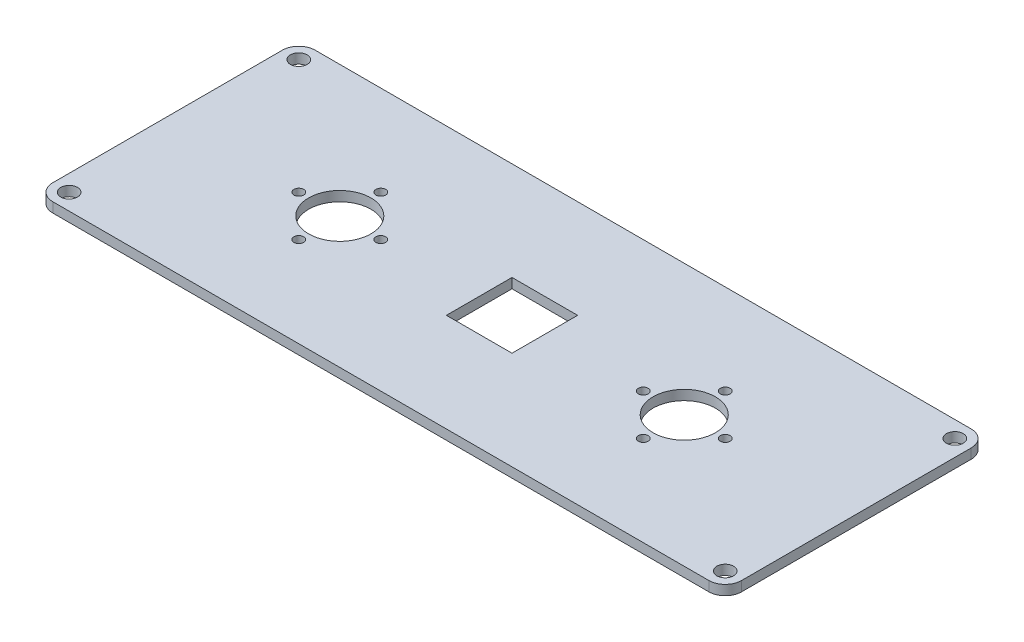
ISO-10303-21;
HEADER;
FILE_DESCRIPTION(('STEP AP214'),'2;1');
FILE_NAME('part.step','',(''),(''),'','','');
FILE_SCHEMA(('AUTOMOTIVE_DESIGN { 1 0 10303 214 1 1 1 1 }'));
ENDSEC;
DATA;
#1=APPLICATION_CONTEXT('core data for automotive mechanical design processes');
#2=APPLICATION_PROTOCOL_DEFINITION('international standard','automotive_design',2000,#1);
#3=PRODUCT_CONTEXT('',#1,'mechanical');
#4=PRODUCT('Part','Part','',(#3));
#5=PRODUCT_RELATED_PRODUCT_CATEGORY('part','',(#4));
#6=PRODUCT_DEFINITION_FORMATION('','',#4);
#7=PRODUCT_DEFINITION_CONTEXT('part definition',#1,'design');
#8=PRODUCT_DEFINITION('design','',#6,#7);
#9=PRODUCT_DEFINITION_SHAPE('','',#8);
#10=(LENGTH_UNIT() NAMED_UNIT(*) SI_UNIT(.MILLI.,.METRE.));
#11=(NAMED_UNIT(*) PLANE_ANGLE_UNIT() SI_UNIT($,.RADIAN.));
#12=(NAMED_UNIT(*) SI_UNIT($,.STERADIAN.) SOLID_ANGLE_UNIT());
#13=UNCERTAINTY_MEASURE_WITH_UNIT(LENGTH_MEASURE(1.E-05),#10,'distance_accuracy_value','');
#14=(GEOMETRIC_REPRESENTATION_CONTEXT(3) GLOBAL_UNCERTAINTY_ASSIGNED_CONTEXT((#13)) GLOBAL_UNIT_ASSIGNED_CONTEXT((#10,
#11,#12)) REPRESENTATION_CONTEXT('',''));
#15=CARTESIAN_POINT('',(0.,0.,0.));
#16=DIRECTION('',(0.,0.,1.));
#17=DIRECTION('',(1.,0.,0.));
#18=AXIS2_PLACEMENT_3D('',#15,#16,#17);
#19=CARTESIAN_POINT('',(0.,-3.,0.));
#20=DIRECTION('',(-1.,0.,0.));
#21=DIRECTION('',(0.,0.,1.));
#22=AXIS2_PLACEMENT_3D('',#19,#20,#21);
#23=PLANE('',#22);
#24=DIRECTION('',(0.,0.,1.));
#25=VECTOR('',#24,1.);
#26=CARTESIAN_POINT('',(0.,-3.,0.));
#27=LINE('',#26,#25);
#28=CARTESIAN_POINT('',(0.,-3.,-75.));
#29=VERTEX_POINT('',#28);
#30=CARTESIAN_POINT('',(0.,-3.,-5.));
#31=VERTEX_POINT('',#30);
#32=EDGE_CURVE('E174',#29,#31,#27,.T.);
#33=ORIENTED_EDGE('',*,*,#32,.T.);
#34=DIRECTION('',(0.,1.,0.));
#35=VECTOR('',#34,1.);
#36=CARTESIAN_POINT('',(0.,-3.,-5.));
#37=LINE('',#36,#35);
#38=CARTESIAN_POINT('',(0.,0.,-5.));
#39=VERTEX_POINT('',#38);
#40=EDGE_CURVE('E198',#31,#39,#37,.T.);
#41=ORIENTED_EDGE('',*,*,#40,.T.);
#42=DIRECTION('',(0.,0.,1.));
#43=VECTOR('',#42,1.);
#44=CARTESIAN_POINT('',(0.,0.,0.));
#45=LINE('',#44,#43);
#46=CARTESIAN_POINT('',(0.,0.,-75.));
#47=VERTEX_POINT('',#46);
#48=EDGE_CURVE('E170',#47,#39,#45,.T.);
#49=ORIENTED_EDGE('',*,*,#48,.F.);
#50=DIRECTION('',(0.,1.,0.));
#51=VECTOR('',#50,1.);
#52=CARTESIAN_POINT('',(0.,-3.,-75.));
#53=LINE('',#52,#51);
#54=EDGE_CURVE('E186',#47,#29,#53,.F.);
#55=ORIENTED_EDGE('',*,*,#54,.T.);
#56=EDGE_LOOP('',(#33,#41,#49,#55));
#57=FACE_BOUND('',#56,.T.);
#58=ADVANCED_FACE('F37',(#57),#23,.T.);
#59=CARTESIAN_POINT('',(0.,-3.,-80.));
#60=DIRECTION('',(0.,0.,-1.));
#61=DIRECTION('',(-1.,0.,0.));
#62=AXIS2_PLACEMENT_3D('',#59,#60,#61);
#63=PLANE('',#62);
#64=DIRECTION('',(-1.,0.,0.));
#65=VECTOR('',#64,1.);
#66=CARTESIAN_POINT('',(0.,0.,-80.));
#67=LINE('',#66,#65);
#68=CARTESIAN_POINT('',(205.,0.,-80.));
#69=VERTEX_POINT('',#68);
#70=CARTESIAN_POINT('',(5.,0.,-80.));
#71=VERTEX_POINT('',#70);
#72=EDGE_CURVE('E178',#69,#71,#67,.T.);
#73=ORIENTED_EDGE('',*,*,#72,.F.);
#74=DIRECTION('',(0.,1.,0.));
#75=VECTOR('',#74,1.);
#76=CARTESIAN_POINT('',(205.,-3.,-80.));
#77=LINE('',#76,#75);
#78=CARTESIAN_POINT('',(205.,-3.,-80.));
#79=VERTEX_POINT('',#78);
#80=EDGE_CURVE('E11',#69,#79,#77,.F.);
#81=ORIENTED_EDGE('',*,*,#80,.T.);
#82=DIRECTION('',(-1.,0.,0.));
#83=VECTOR('',#82,1.);
#84=CARTESIAN_POINT('',(0.,-3.,-80.));
#85=LINE('',#84,#83);
#86=CARTESIAN_POINT('',(5.,-3.,-80.));
#87=VERTEX_POINT('',#86);
#88=EDGE_CURVE('E183',#79,#87,#85,.T.);
#89=ORIENTED_EDGE('',*,*,#88,.T.);
#90=DIRECTION('',(0.,1.,0.));
#91=VECTOR('',#90,1.);
#92=CARTESIAN_POINT('',(5.,-3.,-80.));
#93=LINE('',#92,#91);
#94=EDGE_CURVE('E45',#87,#71,#93,.T.);
#95=ORIENTED_EDGE('',*,*,#94,.T.);
#96=EDGE_LOOP('',(#73,#81,#89,#95));
#97=FACE_BOUND('',#96,.T.);
#98=ADVANCED_FACE('F228',(#97),#63,.T.);
#99=CARTESIAN_POINT('',(210.,-3.,0.));
#100=DIRECTION('',(1.,0.,0.));
#101=DIRECTION('',(0.,0.,-1.));
#102=AXIS2_PLACEMENT_3D('',#99,#100,#101);
#103=PLANE('',#102);
#104=DIRECTION('',(0.,0.,-1.));
#105=VECTOR('',#104,1.);
#106=CARTESIAN_POINT('',(210.,0.,0.));
#107=LINE('',#106,#105);
#108=CARTESIAN_POINT('',(210.,0.,-5.));
#109=VERTEX_POINT('',#108);
#110=CARTESIAN_POINT('',(210.,0.,-75.));
#111=VERTEX_POINT('',#110);
#112=EDGE_CURVE('E192',#109,#111,#107,.T.);
#113=ORIENTED_EDGE('',*,*,#112,.F.);
#114=DIRECTION('',(0.,1.,0.));
#115=VECTOR('',#114,1.);
#116=CARTESIAN_POINT('',(210.,-3.,-5.));
#117=LINE('',#116,#115);
#118=CARTESIAN_POINT('',(210.,-3.,-5.));
#119=VERTEX_POINT('',#118);
#120=EDGE_CURVE('E59',#109,#119,#117,.F.);
#121=ORIENTED_EDGE('',*,*,#120,.T.);
#122=DIRECTION('',(0.,0.,-1.));
#123=VECTOR('',#122,1.);
#124=CARTESIAN_POINT('',(210.,-3.,0.));
#125=LINE('',#124,#123);
#126=CARTESIAN_POINT('',(210.,-3.,-75.));
#127=VERTEX_POINT('',#126);
#128=EDGE_CURVE('E181',#119,#127,#125,.T.);
#129=ORIENTED_EDGE('',*,*,#128,.T.);
#130=DIRECTION('',(0.,1.,0.));
#131=VECTOR('',#130,1.);
#132=CARTESIAN_POINT('',(210.,-3.,-75.));
#133=LINE('',#132,#131);
#134=EDGE_CURVE('E221',#127,#111,#133,.T.);
#135=ORIENTED_EDGE('',*,*,#134,.T.);
#136=EDGE_LOOP('',(#113,#121,#129,#135));
#137=FACE_BOUND('',#136,.T.);
#138=ADVANCED_FACE('F238',(#137),#103,.T.);
#139=CARTESIAN_POINT('',(0.,-3.,0.));
#140=DIRECTION('',(0.,0.,1.));
#141=DIRECTION('',(1.,0.,0.));
#142=AXIS2_PLACEMENT_3D('',#139,#140,#141);
#143=PLANE('',#142);
#144=DIRECTION('',(1.,0.,0.));
#145=VECTOR('',#144,1.);
#146=CARTESIAN_POINT('',(0.,0.,0.));
#147=LINE('',#146,#145);
#148=CARTESIAN_POINT('',(5.,0.,0.));
#149=VERTEX_POINT('',#148);
#150=CARTESIAN_POINT('',(205.,0.,0.));
#151=VERTEX_POINT('',#150);
#152=EDGE_CURVE('E189',#149,#151,#147,.T.);
#153=ORIENTED_EDGE('',*,*,#152,.F.);
#154=DIRECTION('',(0.,1.,0.));
#155=VECTOR('',#154,1.);
#156=CARTESIAN_POINT('',(5.,-3.,0.));
#157=LINE('',#156,#155);
#158=CARTESIAN_POINT('',(5.,-3.,0.));
#159=VERTEX_POINT('',#158);
#160=EDGE_CURVE('E212',#149,#159,#157,.F.);
#161=ORIENTED_EDGE('',*,*,#160,.T.);
#162=DIRECTION('',(1.,0.,0.));
#163=VECTOR('',#162,1.);
#164=CARTESIAN_POINT('',(0.,-3.,0.));
#165=LINE('',#164,#163);
#166=CARTESIAN_POINT('',(205.,-3.,0.));
#167=VERTEX_POINT('',#166);
#168=EDGE_CURVE('E177',#159,#167,#165,.T.);
#169=ORIENTED_EDGE('',*,*,#168,.T.);
#170=DIRECTION('',(0.,1.,0.));
#171=VECTOR('',#170,1.);
#172=CARTESIAN_POINT('',(205.,-3.,0.));
#173=LINE('',#172,#171);
#174=EDGE_CURVE('E209',#167,#151,#173,.T.);
#175=ORIENTED_EDGE('',*,*,#174,.T.);
#176=EDGE_LOOP('',(#153,#161,#169,#175));
#177=FACE_BOUND('',#176,.T.);
#178=ADVANCED_FACE('F246',(#177),#143,.T.);
#179=CARTESIAN_POINT('',(0.,-3.,0.));
#180=DIRECTION('',(0.,-1.,0.));
#181=DIRECTION('',(0.,0.,-1.));
#182=AXIS2_PLACEMENT_3D('',#179,#180,#181);
#183=PLANE('',#182);
#184=CARTESIAN_POINT('',(5.,-3.,-75.));
#185=DIRECTION('',(0.,1.,0.));
#186=DIRECTION('',(0.,0.,1.));
#187=AXIS2_PLACEMENT_3D('',#184,#185,#186);
#188=CIRCLE('',#187,2.5527);
#189=CARTESIAN_POINT('',(5.,-3.,-72.4473));
#190=VERTEX_POINT('',#189);
#191=EDGE_CURVE('E670',#190,#190,#188,.T.);
#192=ORIENTED_EDGE('',*,*,#191,.T.);
#193=EDGE_LOOP('',(#192));
#194=FACE_BOUND('',#193,.T.);
#195=CARTESIAN_POINT('',(5.,-3.,-5.));
#196=DIRECTION('',(0.,1.,0.));
#197=DIRECTION('',(0.,0.,1.));
#198=AXIS2_PLACEMENT_3D('',#195,#196,#197);
#199=CIRCLE('',#198,2.5527);
#200=CARTESIAN_POINT('',(5.,-3.,-2.4473));
#201=VERTEX_POINT('',#200);
#202=EDGE_CURVE('E664',#201,#201,#199,.T.);
#203=ORIENTED_EDGE('',*,*,#202,.T.);
#204=EDGE_LOOP('',(#203));
#205=FACE_BOUND('',#204,.T.);
#206=CARTESIAN_POINT('',(205.,-3.,-5.));
#207=DIRECTION('',(0.,1.,0.));
#208=DIRECTION('',(0.,0.,1.));
#209=AXIS2_PLACEMENT_3D('',#206,#207,#208);
#210=CIRCLE('',#209,2.55269999999999);
#211=CARTESIAN_POINT('',(205.,-3.,-2.44730000000001));
#212=VERTEX_POINT('',#211);
#213=EDGE_CURVE('E658',#212,#212,#210,.T.);
#214=ORIENTED_EDGE('',*,*,#213,.T.);
#215=EDGE_LOOP('',(#214));
#216=FACE_BOUND('',#215,.T.);
#217=CARTESIAN_POINT('',(205.,-3.,-75.));
#218=DIRECTION('',(0.,1.,0.));
#219=DIRECTION('',(0.,0.,1.));
#220=AXIS2_PLACEMENT_3D('',#217,#218,#219);
#221=CIRCLE('',#220,2.55269999999999);
#222=CARTESIAN_POINT('',(205.,-3.,-72.4473));
#223=VERTEX_POINT('',#222);
#224=EDGE_CURVE('E551',#223,#223,#221,.T.);
#225=ORIENTED_EDGE('',*,*,#224,.T.);
#226=EDGE_LOOP('',(#225));
#227=FACE_BOUND('',#226,.T.);
#228=CARTESIAN_POINT('',(52.5,-3.,-40.));
#229=DIRECTION('',(0.,1.,0.));
#230=DIRECTION('',(0.,0.,1.));
#231=AXIS2_PLACEMENT_3D('',#228,#229,#230);
#232=CIRCLE('',#231,9.5);
#233=CARTESIAN_POINT('',(52.5,-3.,-30.5));
#234=VERTEX_POINT('',#233);
#235=EDGE_CURVE('E546',#234,#234,#232,.T.);
#236=ORIENTED_EDGE('',*,*,#235,.T.);
#237=EDGE_LOOP('',(#236));
#238=FACE_BOUND('',#237,.T.);
#239=CARTESIAN_POINT('',(157.5,-3.,-40.));
#240=DIRECTION('',(0.,1.,0.));
#241=DIRECTION('',(0.,0.,1.));
#242=AXIS2_PLACEMENT_3D('',#239,#240,#241);
#243=CIRCLE('',#242,9.50000000000001);
#244=CARTESIAN_POINT('',(157.5,-3.,-30.5));
#245=VERTEX_POINT('',#244);
#246=EDGE_CURVE('E559',#245,#245,#243,.T.);
#247=ORIENTED_EDGE('',*,*,#246,.T.);
#248=EDGE_LOOP('',(#247));
#249=FACE_BOUND('',#248,.T.);
#250=CARTESIAN_POINT('',(145.,-3.,-40.));
#251=DIRECTION('',(0.,1.,0.));
#252=DIRECTION('',(0.,0.,1.));
#253=AXIS2_PLACEMENT_3D('',#250,#251,#252);
#254=CIRCLE('',#253,1.49999999999999);
#255=CARTESIAN_POINT('',(145.,-3.,-38.5));
#256=VERTEX_POINT('',#255);
#257=EDGE_CURVE('E565',#256,#256,#254,.T.);
#258=ORIENTED_EDGE('',*,*,#257,.T.);
#259=EDGE_LOOP('',(#258));
#260=FACE_BOUND('',#259,.T.);
#261=CARTESIAN_POINT('',(157.5,-3.,-27.5));
#262=DIRECTION('',(0.,1.,0.));
#263=DIRECTION('',(0.,0.,1.));
#264=AXIS2_PLACEMENT_3D('',#261,#262,#263);
#265=CIRCLE('',#264,1.5);
#266=CARTESIAN_POINT('',(157.5,-3.,-26.));
#267=VERTEX_POINT('',#266);
#268=EDGE_CURVE('E571',#267,#267,#265,.T.);
#269=ORIENTED_EDGE('',*,*,#268,.T.);
#270=EDGE_LOOP('',(#269));
#271=FACE_BOUND('',#270,.T.);
#272=CARTESIAN_POINT('',(170.,-3.,-40.0000000000001));
#273=DIRECTION('',(0.,1.,0.));
#274=DIRECTION('',(0.,0.,1.));
#275=AXIS2_PLACEMENT_3D('',#272,#273,#274);
#276=CIRCLE('',#275,1.5);
#277=CARTESIAN_POINT('',(170.,-3.,-38.5000000000001));
#278=VERTEX_POINT('',#277);
#279=EDGE_CURVE('E577',#278,#278,#276,.T.);
#280=ORIENTED_EDGE('',*,*,#279,.T.);
#281=EDGE_LOOP('',(#280));
#282=FACE_BOUND('',#281,.T.);
#283=CARTESIAN_POINT('',(40.0000000000002,-3.,-40.));
#284=DIRECTION('',(0.,1.,0.));
#285=DIRECTION('',(0.,0.,1.));
#286=AXIS2_PLACEMENT_3D('',#283,#284,#285);
#287=CIRCLE('',#286,1.50000000000001);
#288=CARTESIAN_POINT('',(40.0000000000002,-3.,-38.5));
#289=VERTEX_POINT('',#288);
#290=EDGE_CURVE('E583',#289,#289,#287,.T.);
#291=ORIENTED_EDGE('',*,*,#290,.T.);
#292=EDGE_LOOP('',(#291));
#293=FACE_BOUND('',#292,.T.);
#294=CARTESIAN_POINT('',(52.5000000000003,-3.,-27.5));
#295=DIRECTION('',(0.,1.,0.));
#296=DIRECTION('',(0.,0.,1.));
#297=AXIS2_PLACEMENT_3D('',#294,#295,#296);
#298=CIRCLE('',#297,1.5);
#299=CARTESIAN_POINT('',(52.5000000000003,-3.,-26.));
#300=VERTEX_POINT('',#299);
#301=EDGE_CURVE('E589',#300,#300,#298,.T.);
#302=ORIENTED_EDGE('',*,*,#301,.T.);
#303=EDGE_LOOP('',(#302));
#304=FACE_BOUND('',#303,.T.);
#305=CARTESIAN_POINT('',(65.0000000000002,-3.,-40.0000000000001));
#306=DIRECTION('',(0.,1.,0.));
#307=DIRECTION('',(0.,0.,1.));
#308=AXIS2_PLACEMENT_3D('',#305,#306,#307);
#309=CIRCLE('',#308,1.50000000000001);
#310=CARTESIAN_POINT('',(65.0000000000002,-3.,-38.5000000000001));
#311=VERTEX_POINT('',#310);
#312=EDGE_CURVE('E595',#311,#311,#309,.T.);
#313=ORIENTED_EDGE('',*,*,#312,.T.);
#314=EDGE_LOOP('',(#313));
#315=FACE_BOUND('',#314,.T.);
#316=CARTESIAN_POINT('',(157.5,-3.,-52.5));
#317=DIRECTION('',(0.,1.,0.));
#318=DIRECTION('',(0.,0.,1.));
#319=AXIS2_PLACEMENT_3D('',#316,#317,#318);
#320=CIRCLE('',#319,1.5);
#321=CARTESIAN_POINT('',(157.5,-3.,-51.));
#322=VERTEX_POINT('',#321);
#323=EDGE_CURVE('E601',#322,#322,#320,.T.);
#324=ORIENTED_EDGE('',*,*,#323,.T.);
#325=EDGE_LOOP('',(#324));
#326=FACE_BOUND('',#325,.T.);
#327=CARTESIAN_POINT('',(52.5,-3.,-52.5));
#328=DIRECTION('',(0.,1.,0.));
#329=DIRECTION('',(0.,0.,1.));
#330=AXIS2_PLACEMENT_3D('',#327,#328,#329);
#331=CIRCLE('',#330,1.5);
#332=CARTESIAN_POINT('',(52.5,-3.,-51.));
#333=VERTEX_POINT('',#332);
#334=EDGE_CURVE('E164',#333,#333,#331,.T.);
#335=ORIENTED_EDGE('',*,*,#334,.T.);
#336=EDGE_LOOP('',(#335));
#337=FACE_BOUND('',#336,.T.);
#338=DIRECTION('',(0.,0.,1.));
#339=VECTOR('',#338,1.);
#340=CARTESIAN_POINT('',(95.,-3.,-50.));
#341=LINE('',#340,#339);
#342=CARTESIAN_POINT('',(95.,-3.,-50.));
#343=VERTEX_POINT('',#342);
#344=CARTESIAN_POINT('',(95.,-3.,-30.));
#345=VERTEX_POINT('',#344);
#346=EDGE_CURVE('E131',#343,#345,#341,.T.);
#347=ORIENTED_EDGE('',*,*,#346,.T.);
#348=DIRECTION('',(1.,0.,0.));
#349=VECTOR('',#348,1.);
#350=CARTESIAN_POINT('',(95.,-3.,-30.));
#351=LINE('',#350,#349);
#352=CARTESIAN_POINT('',(115.,-3.,-30.));
#353=VERTEX_POINT('',#352);
#354=EDGE_CURVE('E143',#345,#353,#351,.T.);
#355=ORIENTED_EDGE('',*,*,#354,.T.);
#356=DIRECTION('',(0.,0.,-1.));
#357=VECTOR('',#356,1.);
#358=CARTESIAN_POINT('',(115.,-3.,-50.));
#359=LINE('',#358,#357);
#360=CARTESIAN_POINT('',(115.,-3.,-50.));
#361=VERTEX_POINT('',#360);
#362=EDGE_CURVE('E147',#353,#361,#359,.T.);
#363=ORIENTED_EDGE('',*,*,#362,.T.);
#364=DIRECTION('',(-1.,0.,0.));
#365=VECTOR('',#364,1.);
#366=CARTESIAN_POINT('',(95.,-3.,-50.));
#367=LINE('',#366,#365);
#368=EDGE_CURVE('E139',#361,#343,#367,.T.);
#369=ORIENTED_EDGE('',*,*,#368,.T.);
#370=EDGE_LOOP('',(#347,#355,#363,#369));
#371=FACE_BOUND('',#370,.T.);
#372=ORIENTED_EDGE('',*,*,#168,.F.);
#373=CARTESIAN_POINT('',(5.,-3.,-5.));
#374=DIRECTION('',(0.,-1.,0.));
#375=DIRECTION('',(0.,0.,-1.));
#376=AXIS2_PLACEMENT_3D('',#373,#374,#375);
#377=CIRCLE('',#376,5.);
#378=EDGE_CURVE('E219',#159,#31,#377,.T.);
#379=ORIENTED_EDGE('',*,*,#378,.T.);
#380=ORIENTED_EDGE('',*,*,#32,.F.);
#381=CARTESIAN_POINT('',(5.,-3.,-75.));
#382=DIRECTION('',(0.,-1.,0.));
#383=DIRECTION('',(0.,0.,-1.));
#384=AXIS2_PLACEMENT_3D('',#381,#382,#383);
#385=CIRCLE('',#384,5.);
#386=EDGE_CURVE('E214',#29,#87,#385,.T.);
#387=ORIENTED_EDGE('',*,*,#386,.T.);
#388=ORIENTED_EDGE('',*,*,#88,.F.);
#389=CARTESIAN_POINT('',(205.,-3.,-75.));
#390=DIRECTION('',(0.,-1.,0.));
#391=DIRECTION('',(0.,0.,-1.));
#392=AXIS2_PLACEMENT_3D('',#389,#390,#391);
#393=CIRCLE('',#392,5.);
#394=EDGE_CURVE('E52',#79,#127,#393,.T.);
#395=ORIENTED_EDGE('',*,*,#394,.T.);
#396=ORIENTED_EDGE('',*,*,#128,.F.);
#397=CARTESIAN_POINT('',(205.,-3.,-5.));
#398=DIRECTION('',(0.,-1.,0.));
#399=DIRECTION('',(0.,0.,-1.));
#400=AXIS2_PLACEMENT_3D('',#397,#398,#399);
#401=CIRCLE('',#400,5.);
#402=EDGE_CURVE('E217',#119,#167,#401,.T.);
#403=ORIENTED_EDGE('',*,*,#402,.T.);
#404=EDGE_LOOP('',(#372,#379,#380,#387,#388,#395,#396,#403));
#405=FACE_BOUND('',#404,.T.);
#406=ADVANCED_FACE('F149',(#194,#205,#216,#227,#238,#249,#260,#271,#282,#293,#304,#315,#326,
#337,#371,#405),#183,.T.);
#407=CARTESIAN_POINT('',(0.,0.,0.));
#408=DIRECTION('',(0.,-1.,0.));
#409=DIRECTION('',(0.,0.,-1.));
#410=AXIS2_PLACEMENT_3D('',#407,#408,#409);
#411=PLANE('',#410);
#412=CARTESIAN_POINT('',(5.,0.,-75.));
#413=DIRECTION('',(0.,1.,0.));
#414=DIRECTION('',(0.,0.,1.));
#415=AXIS2_PLACEMENT_3D('',#412,#413,#414);
#416=CIRCLE('',#415,2.55269999999999);
#417=CARTESIAN_POINT('',(5.,0.,-72.4473));
#418=VERTEX_POINT('',#417);
#419=EDGE_CURVE('E673',#418,#418,#416,.T.);
#420=ORIENTED_EDGE('',*,*,#419,.F.);
#421=EDGE_LOOP('',(#420));
#422=FACE_BOUND('',#421,.T.);
#423=CARTESIAN_POINT('',(5.,0.,-5.));
#424=DIRECTION('',(0.,1.,0.));
#425=DIRECTION('',(0.,0.,1.));
#426=AXIS2_PLACEMENT_3D('',#423,#424,#425);
#427=CIRCLE('',#426,2.55269999999999);
#428=CARTESIAN_POINT('',(5.,0.,-2.44730000000001));
#429=VERTEX_POINT('',#428);
#430=EDGE_CURVE('E667',#429,#429,#427,.T.);
#431=ORIENTED_EDGE('',*,*,#430,.F.);
#432=EDGE_LOOP('',(#431));
#433=FACE_BOUND('',#432,.T.);
#434=CARTESIAN_POINT('',(205.,0.,-5.));
#435=DIRECTION('',(0.,1.,0.));
#436=DIRECTION('',(0.,0.,1.));
#437=AXIS2_PLACEMENT_3D('',#434,#435,#436);
#438=CIRCLE('',#437,2.55269999999999);
#439=CARTESIAN_POINT('',(205.,0.,-2.44730000000001));
#440=VERTEX_POINT('',#439);
#441=EDGE_CURVE('E661',#440,#440,#438,.T.);
#442=ORIENTED_EDGE('',*,*,#441,.F.);
#443=EDGE_LOOP('',(#442));
#444=FACE_BOUND('',#443,.T.);
#445=CARTESIAN_POINT('',(205.,0.,-75.));
#446=DIRECTION('',(0.,1.,0.));
#447=DIRECTION('',(0.,0.,1.));
#448=AXIS2_PLACEMENT_3D('',#445,#446,#447);
#449=CIRCLE('',#448,2.55269999999999);
#450=CARTESIAN_POINT('',(205.,0.,-72.4473));
#451=VERTEX_POINT('',#450);
#452=EDGE_CURVE('E556',#451,#451,#449,.T.);
#453=ORIENTED_EDGE('',*,*,#452,.F.);
#454=EDGE_LOOP('',(#453));
#455=FACE_BOUND('',#454,.T.);
#456=CARTESIAN_POINT('',(52.5,0.,-40.));
#457=DIRECTION('',(0.,1.,0.));
#458=DIRECTION('',(0.,0.,1.));
#459=AXIS2_PLACEMENT_3D('',#456,#457,#458);
#460=CIRCLE('',#459,9.5);
#461=CARTESIAN_POINT('',(52.5,0.,-30.5));
#462=VERTEX_POINT('',#461);
#463=EDGE_CURVE('E549',#462,#462,#460,.T.);
#464=ORIENTED_EDGE('',*,*,#463,.F.);
#465=EDGE_LOOP('',(#464));
#466=FACE_BOUND('',#465,.T.);
#467=CARTESIAN_POINT('',(157.5,0.,-40.));
#468=DIRECTION('',(0.,1.,0.));
#469=DIRECTION('',(0.,0.,1.));
#470=AXIS2_PLACEMENT_3D('',#467,#468,#469);
#471=CIRCLE('',#470,9.50000000000001);
#472=CARTESIAN_POINT('',(157.5,0.,-30.5));
#473=VERTEX_POINT('',#472);
#474=EDGE_CURVE('E553',#473,#473,#471,.T.);
#475=ORIENTED_EDGE('',*,*,#474,.F.);
#476=EDGE_LOOP('',(#475));
#477=FACE_BOUND('',#476,.T.);
#478=CARTESIAN_POINT('',(145.,0.,-40.));
#479=DIRECTION('',(0.,1.,0.));
#480=DIRECTION('',(0.,0.,1.));
#481=AXIS2_PLACEMENT_3D('',#478,#479,#480);
#482=CIRCLE('',#481,1.49999999999999);
#483=CARTESIAN_POINT('',(145.,0.,-38.5));
#484=VERTEX_POINT('',#483);
#485=EDGE_CURVE('E562',#484,#484,#482,.T.);
#486=ORIENTED_EDGE('',*,*,#485,.F.);
#487=EDGE_LOOP('',(#486));
#488=FACE_BOUND('',#487,.T.);
#489=CARTESIAN_POINT('',(157.5,0.,-27.5));
#490=DIRECTION('',(0.,1.,0.));
#491=DIRECTION('',(0.,0.,1.));
#492=AXIS2_PLACEMENT_3D('',#489,#490,#491);
#493=CIRCLE('',#492,1.5);
#494=CARTESIAN_POINT('',(157.5,0.,-26.));
#495=VERTEX_POINT('',#494);
#496=EDGE_CURVE('E568',#495,#495,#493,.T.);
#497=ORIENTED_EDGE('',*,*,#496,.F.);
#498=EDGE_LOOP('',(#497));
#499=FACE_BOUND('',#498,.T.);
#500=CARTESIAN_POINT('',(170.,0.,-40.0000000000001));
#501=DIRECTION('',(0.,1.,0.));
#502=DIRECTION('',(0.,0.,1.));
#503=AXIS2_PLACEMENT_3D('',#500,#501,#502);
#504=CIRCLE('',#503,1.5);
#505=CARTESIAN_POINT('',(170.,0.,-38.5000000000001));
#506=VERTEX_POINT('',#505);
#507=EDGE_CURVE('E574',#506,#506,#504,.T.);
#508=ORIENTED_EDGE('',*,*,#507,.F.);
#509=EDGE_LOOP('',(#508));
#510=FACE_BOUND('',#509,.T.);
#511=CARTESIAN_POINT('',(40.0000000000002,0.,-40.));
#512=DIRECTION('',(0.,1.,0.));
#513=DIRECTION('',(0.,0.,1.));
#514=AXIS2_PLACEMENT_3D('',#511,#512,#513);
#515=CIRCLE('',#514,1.50000000000001);
#516=CARTESIAN_POINT('',(40.0000000000002,0.,-38.5));
#517=VERTEX_POINT('',#516);
#518=EDGE_CURVE('E580',#517,#517,#515,.T.);
#519=ORIENTED_EDGE('',*,*,#518,.F.);
#520=EDGE_LOOP('',(#519));
#521=FACE_BOUND('',#520,.T.);
#522=CARTESIAN_POINT('',(52.5000000000003,0.,-27.5));
#523=DIRECTION('',(0.,1.,0.));
#524=DIRECTION('',(0.,0.,1.));
#525=AXIS2_PLACEMENT_3D('',#522,#523,#524);
#526=CIRCLE('',#525,1.5);
#527=CARTESIAN_POINT('',(52.5000000000003,0.,-26.));
#528=VERTEX_POINT('',#527);
#529=EDGE_CURVE('E586',#528,#528,#526,.T.);
#530=ORIENTED_EDGE('',*,*,#529,.F.);
#531=EDGE_LOOP('',(#530));
#532=FACE_BOUND('',#531,.T.);
#533=CARTESIAN_POINT('',(65.0000000000002,0.,-40.0000000000001));
#534=DIRECTION('',(0.,1.,0.));
#535=DIRECTION('',(0.,0.,1.));
#536=AXIS2_PLACEMENT_3D('',#533,#534,#535);
#537=CIRCLE('',#536,1.50000000000001);
#538=CARTESIAN_POINT('',(65.0000000000002,0.,-38.5000000000001));
#539=VERTEX_POINT('',#538);
#540=EDGE_CURVE('E592',#539,#539,#537,.T.);
#541=ORIENTED_EDGE('',*,*,#540,.F.);
#542=EDGE_LOOP('',(#541));
#543=FACE_BOUND('',#542,.T.);
#544=CARTESIAN_POINT('',(157.5,0.,-52.5));
#545=DIRECTION('',(0.,1.,0.));
#546=DIRECTION('',(0.,0.,1.));
#547=AXIS2_PLACEMENT_3D('',#544,#545,#546);
#548=CIRCLE('',#547,1.5);
#549=CARTESIAN_POINT('',(157.5,0.,-51.));
#550=VERTEX_POINT('',#549);
#551=EDGE_CURVE('E598',#550,#550,#548,.T.);
#552=ORIENTED_EDGE('',*,*,#551,.F.);
#553=EDGE_LOOP('',(#552));
#554=FACE_BOUND('',#553,.T.);
#555=CARTESIAN_POINT('',(52.5,0.,-52.5));
#556=DIRECTION('',(0.,1.,0.));
#557=DIRECTION('',(0.,0.,1.));
#558=AXIS2_PLACEMENT_3D('',#555,#556,#557);
#559=CIRCLE('',#558,1.5);
#560=CARTESIAN_POINT('',(52.5,0.,-51.));
#561=VERTEX_POINT('',#560);
#562=EDGE_CURVE('E157',#561,#561,#559,.T.);
#563=ORIENTED_EDGE('',*,*,#562,.F.);
#564=EDGE_LOOP('',(#563));
#565=FACE_BOUND('',#564,.T.);
#566=DIRECTION('',(1.,0.,0.));
#567=VECTOR('',#566,1.);
#568=CARTESIAN_POINT('',(95.,0.,-30.));
#569=LINE('',#568,#567);
#570=CARTESIAN_POINT('',(95.,0.,-30.));
#571=VERTEX_POINT('',#570);
#572=CARTESIAN_POINT('',(115.,0.,-30.));
#573=VERTEX_POINT('',#572);
#574=EDGE_CURVE('E163',#571,#573,#569,.T.);
#575=ORIENTED_EDGE('',*,*,#574,.F.);
#576=DIRECTION('',(0.,0.,1.));
#577=VECTOR('',#576,1.);
#578=CARTESIAN_POINT('',(95.,0.,-50.));
#579=LINE('',#578,#577);
#580=CARTESIAN_POINT('',(95.,0.,-50.));
#581=VERTEX_POINT('',#580);
#582=EDGE_CURVE('E134',#581,#571,#579,.T.);
#583=ORIENTED_EDGE('',*,*,#582,.F.);
#584=DIRECTION('',(-1.,0.,0.));
#585=VECTOR('',#584,1.);
#586=CARTESIAN_POINT('',(95.,0.,-50.));
#587=LINE('',#586,#585);
#588=CARTESIAN_POINT('',(115.,0.,-50.));
#589=VERTEX_POINT('',#588);
#590=EDGE_CURVE('E151',#589,#581,#587,.T.);
#591=ORIENTED_EDGE('',*,*,#590,.F.);
#592=DIRECTION('',(0.,0.,-1.));
#593=VECTOR('',#592,1.);
#594=CARTESIAN_POINT('',(115.,0.,-50.));
#595=LINE('',#594,#593);
#596=EDGE_CURVE('E154',#573,#589,#595,.T.);
#597=ORIENTED_EDGE('',*,*,#596,.F.);
#598=EDGE_LOOP('',(#575,#583,#591,#597));
#599=FACE_BOUND('',#598,.T.);
#600=ORIENTED_EDGE('',*,*,#48,.T.);
#601=CARTESIAN_POINT('',(5.,0.,-5.));
#602=DIRECTION('',(0.,-1.,0.));
#603=DIRECTION('',(0.,0.,-1.));
#604=AXIS2_PLACEMENT_3D('',#601,#602,#603);
#605=CIRCLE('',#604,5.);
#606=EDGE_CURVE('E207',#39,#149,#605,.F.);
#607=ORIENTED_EDGE('',*,*,#606,.T.);
#608=ORIENTED_EDGE('',*,*,#152,.T.);
#609=CARTESIAN_POINT('',(205.,0.,-5.));
#610=DIRECTION('',(0.,-1.,0.));
#611=DIRECTION('',(0.,0.,-1.));
#612=AXIS2_PLACEMENT_3D('',#609,#610,#611);
#613=CIRCLE('',#612,5.);
#614=EDGE_CURVE('E205',#151,#109,#613,.F.);
#615=ORIENTED_EDGE('',*,*,#614,.T.);
#616=ORIENTED_EDGE('',*,*,#112,.T.);
#617=CARTESIAN_POINT('',(205.,0.,-75.));
#618=DIRECTION('',(0.,-1.,0.));
#619=DIRECTION('',(0.,0.,-1.));
#620=AXIS2_PLACEMENT_3D('',#617,#618,#619);
#621=CIRCLE('',#620,5.);
#622=EDGE_CURVE('E203',#111,#69,#621,.F.);
#623=ORIENTED_EDGE('',*,*,#622,.T.);
#624=ORIENTED_EDGE('',*,*,#72,.T.);
#625=CARTESIAN_POINT('',(5.,0.,-75.));
#626=DIRECTION('',(0.,-1.,0.));
#627=DIRECTION('',(0.,0.,-1.));
#628=AXIS2_PLACEMENT_3D('',#625,#626,#627);
#629=CIRCLE('',#628,5.);
#630=EDGE_CURVE('E201',#71,#47,#629,.F.);
#631=ORIENTED_EDGE('',*,*,#630,.T.);
#632=EDGE_LOOP('',(#600,#607,#608,#615,#616,#623,#624,#631));
#633=FACE_BOUND('',#632,.T.);
#634=ADVANCED_FACE('F233',(#422,#433,#444,#455,#466,#477,#488,#499,#510,#521,#532,#543,#554,
#565,#599,#633),#411,.F.);
#635=CARTESIAN_POINT('',(95.,-3.,-50.));
#636=DIRECTION('',(-1.,0.,0.));
#637=DIRECTION('',(0.,0.,1.));
#638=AXIS2_PLACEMENT_3D('',#635,#636,#637);
#639=PLANE('',#638);
#640=ORIENTED_EDGE('',*,*,#582,.T.);
#641=DIRECTION('',(0.,1.,0.));
#642=VECTOR('',#641,1.);
#643=CARTESIAN_POINT('',(95.,-3.,-30.));
#644=LINE('',#643,#642);
#645=EDGE_CURVE('E127',#345,#571,#644,.T.);
#646=ORIENTED_EDGE('',*,*,#645,.F.);
#647=ORIENTED_EDGE('',*,*,#346,.F.);
#648=DIRECTION('',(0.,1.,0.));
#649=VECTOR('',#648,1.);
#650=CARTESIAN_POINT('',(95.,-3.,-50.));
#651=LINE('',#650,#649);
#652=EDGE_CURVE('E168',#343,#581,#651,.T.);
#653=ORIENTED_EDGE('',*,*,#652,.T.);
#654=EDGE_LOOP('',(#640,#646,#647,#653));
#655=FACE_BOUND('',#654,.T.);
#656=ADVANCED_FACE('F129',(#655),#639,.F.);
#657=CARTESIAN_POINT('',(95.,-3.,-50.));
#658=DIRECTION('',(0.,0.,-1.));
#659=DIRECTION('',(-1.,0.,0.));
#660=AXIS2_PLACEMENT_3D('',#657,#658,#659);
#661=PLANE('',#660);
#662=ORIENTED_EDGE('',*,*,#590,.T.);
#663=ORIENTED_EDGE('',*,*,#652,.F.);
#664=ORIENTED_EDGE('',*,*,#368,.F.);
#665=DIRECTION('',(0.,1.,0.));
#666=VECTOR('',#665,1.);
#667=CARTESIAN_POINT('',(115.,-3.,-50.));
#668=LINE('',#667,#666);
#669=EDGE_CURVE('E171',#361,#589,#668,.T.);
#670=ORIENTED_EDGE('',*,*,#669,.T.);
#671=EDGE_LOOP('',(#662,#663,#664,#670));
#672=FACE_BOUND('',#671,.T.);
#673=ADVANCED_FACE('F386',(#672),#661,.F.);
#674=CARTESIAN_POINT('',(115.,-3.,-50.));
#675=DIRECTION('',(1.,0.,0.));
#676=DIRECTION('',(0.,0.,-1.));
#677=AXIS2_PLACEMENT_3D('',#674,#675,#676);
#678=PLANE('',#677);
#679=ORIENTED_EDGE('',*,*,#596,.T.);
#680=ORIENTED_EDGE('',*,*,#669,.F.);
#681=ORIENTED_EDGE('',*,*,#362,.F.);
#682=DIRECTION('',(0.,1.,0.));
#683=VECTOR('',#682,1.);
#684=CARTESIAN_POINT('',(115.,-3.,-30.));
#685=LINE('',#684,#683);
#686=EDGE_CURVE('E138',#353,#573,#685,.T.);
#687=ORIENTED_EDGE('',*,*,#686,.T.);
#688=EDGE_LOOP('',(#679,#680,#681,#687));
#689=FACE_BOUND('',#688,.T.);
#690=ADVANCED_FACE('F392',(#689),#678,.F.);
#691=CARTESIAN_POINT('',(95.,-3.,-30.));
#692=DIRECTION('',(0.,0.,1.));
#693=DIRECTION('',(1.,0.,0.));
#694=AXIS2_PLACEMENT_3D('',#691,#692,#693);
#695=PLANE('',#694);
#696=ORIENTED_EDGE('',*,*,#574,.T.);
#697=ORIENTED_EDGE('',*,*,#686,.F.);
#698=ORIENTED_EDGE('',*,*,#354,.F.);
#699=ORIENTED_EDGE('',*,*,#645,.T.);
#700=EDGE_LOOP('',(#696,#697,#698,#699));
#701=FACE_BOUND('',#700,.T.);
#702=ADVANCED_FACE('F144',(#701),#695,.F.);
#703=CARTESIAN_POINT('',(52.5,-3.,-52.5));
#704=DIRECTION('',(0.,1.,0.));
#705=DIRECTION('',(0.,0.,1.));
#706=AXIS2_PLACEMENT_3D('',#703,#704,#705);
#707=CYLINDRICAL_SURFACE('',#706,1.5);
#708=ORIENTED_EDGE('',*,*,#334,.F.);
#709=EDGE_LOOP('',(#708));
#710=FACE_BOUND('',#709,.T.);
#711=ORIENTED_EDGE('',*,*,#562,.T.);
#712=EDGE_LOOP('',(#711));
#713=FACE_BOUND('',#712,.T.);
#714=ADVANCED_FACE('F407',(#710,#713),#707,.F.);
#715=CARTESIAN_POINT('',(157.5,-3.,-52.5));
#716=DIRECTION('',(0.,1.,0.));
#717=DIRECTION('',(0.,0.,1.));
#718=AXIS2_PLACEMENT_3D('',#715,#716,#717);
#719=CYLINDRICAL_SURFACE('',#718,1.5);
#720=ORIENTED_EDGE('',*,*,#323,.F.);
#721=EDGE_LOOP('',(#720));
#722=FACE_BOUND('',#721,.T.);
#723=ORIENTED_EDGE('',*,*,#551,.T.);
#724=EDGE_LOOP('',(#723));
#725=FACE_BOUND('',#724,.T.);
#726=ADVANCED_FACE('F414',(#722,#725),#719,.F.);
#727=CARTESIAN_POINT('',(65.0000000000002,-3.,-40.0000000000001));
#728=DIRECTION('',(0.,1.,0.));
#729=DIRECTION('',(0.,0.,1.));
#730=AXIS2_PLACEMENT_3D('',#727,#728,#729);
#731=CYLINDRICAL_SURFACE('',#730,1.50000000000001);
#732=ORIENTED_EDGE('',*,*,#312,.F.);
#733=EDGE_LOOP('',(#732));
#734=FACE_BOUND('',#733,.T.);
#735=ORIENTED_EDGE('',*,*,#540,.T.);
#736=EDGE_LOOP('',(#735));
#737=FACE_BOUND('',#736,.T.);
#738=ADVANCED_FACE('F422',(#734,#737),#731,.F.);
#739=CARTESIAN_POINT('',(52.5000000000003,-3.,-27.5));
#740=DIRECTION('',(0.,1.,0.));
#741=DIRECTION('',(0.,0.,1.));
#742=AXIS2_PLACEMENT_3D('',#739,#740,#741);
#743=CYLINDRICAL_SURFACE('',#742,1.5);
#744=ORIENTED_EDGE('',*,*,#301,.F.);
#745=EDGE_LOOP('',(#744));
#746=FACE_BOUND('',#745,.T.);
#747=ORIENTED_EDGE('',*,*,#529,.T.);
#748=EDGE_LOOP('',(#747));
#749=FACE_BOUND('',#748,.T.);
#750=ADVANCED_FACE('F430',(#746,#749),#743,.F.);
#751=CARTESIAN_POINT('',(40.0000000000002,-3.,-40.));
#752=DIRECTION('',(0.,1.,0.));
#753=DIRECTION('',(0.,0.,1.));
#754=AXIS2_PLACEMENT_3D('',#751,#752,#753);
#755=CYLINDRICAL_SURFACE('',#754,1.50000000000001);
#756=ORIENTED_EDGE('',*,*,#290,.F.);
#757=EDGE_LOOP('',(#756));
#758=FACE_BOUND('',#757,.T.);
#759=ORIENTED_EDGE('',*,*,#518,.T.);
#760=EDGE_LOOP('',(#759));
#761=FACE_BOUND('',#760,.T.);
#762=ADVANCED_FACE('F438',(#758,#761),#755,.F.);
#763=CARTESIAN_POINT('',(170.,-3.,-40.0000000000001));
#764=DIRECTION('',(0.,1.,0.));
#765=DIRECTION('',(0.,0.,1.));
#766=AXIS2_PLACEMENT_3D('',#763,#764,#765);
#767=CYLINDRICAL_SURFACE('',#766,1.5);
#768=ORIENTED_EDGE('',*,*,#279,.F.);
#769=EDGE_LOOP('',(#768));
#770=FACE_BOUND('',#769,.T.);
#771=ORIENTED_EDGE('',*,*,#507,.T.);
#772=EDGE_LOOP('',(#771));
#773=FACE_BOUND('',#772,.T.);
#774=ADVANCED_FACE('F446',(#770,#773),#767,.F.);
#775=CARTESIAN_POINT('',(157.5,-3.,-27.5));
#776=DIRECTION('',(0.,1.,0.));
#777=DIRECTION('',(0.,0.,1.));
#778=AXIS2_PLACEMENT_3D('',#775,#776,#777);
#779=CYLINDRICAL_SURFACE('',#778,1.5);
#780=ORIENTED_EDGE('',*,*,#268,.F.);
#781=EDGE_LOOP('',(#780));
#782=FACE_BOUND('',#781,.T.);
#783=ORIENTED_EDGE('',*,*,#496,.T.);
#784=EDGE_LOOP('',(#783));
#785=FACE_BOUND('',#784,.T.);
#786=ADVANCED_FACE('F454',(#782,#785),#779,.F.);
#787=CARTESIAN_POINT('',(145.,-3.,-40.));
#788=DIRECTION('',(0.,1.,0.));
#789=DIRECTION('',(0.,0.,1.));
#790=AXIS2_PLACEMENT_3D('',#787,#788,#789);
#791=CYLINDRICAL_SURFACE('',#790,1.49999999999999);
#792=ORIENTED_EDGE('',*,*,#257,.F.);
#793=EDGE_LOOP('',(#792));
#794=FACE_BOUND('',#793,.T.);
#795=ORIENTED_EDGE('',*,*,#485,.T.);
#796=EDGE_LOOP('',(#795));
#797=FACE_BOUND('',#796,.T.);
#798=ADVANCED_FACE('F462',(#794,#797),#791,.F.);
#799=CARTESIAN_POINT('',(157.5,-3.,-40.));
#800=DIRECTION('',(0.,1.,0.));
#801=DIRECTION('',(0.,0.,1.));
#802=AXIS2_PLACEMENT_3D('',#799,#800,#801);
#803=CYLINDRICAL_SURFACE('',#802,9.50000000000001);
#804=ORIENTED_EDGE('',*,*,#246,.F.);
#805=EDGE_LOOP('',(#804));
#806=FACE_BOUND('',#805,.T.);
#807=ORIENTED_EDGE('',*,*,#474,.T.);
#808=EDGE_LOOP('',(#807));
#809=FACE_BOUND('',#808,.T.);
#810=ADVANCED_FACE('F470',(#806,#809),#803,.F.);
#811=CARTESIAN_POINT('',(52.5,-3.,-40.));
#812=DIRECTION('',(0.,1.,0.));
#813=DIRECTION('',(0.,0.,1.));
#814=AXIS2_PLACEMENT_3D('',#811,#812,#813);
#815=CYLINDRICAL_SURFACE('',#814,9.5);
#816=ORIENTED_EDGE('',*,*,#235,.F.);
#817=EDGE_LOOP('',(#816));
#818=FACE_BOUND('',#817,.T.);
#819=ORIENTED_EDGE('',*,*,#463,.T.);
#820=EDGE_LOOP('',(#819));
#821=FACE_BOUND('',#820,.T.);
#822=ADVANCED_FACE('F275',(#818,#821),#815,.F.);
#823=CARTESIAN_POINT('',(5.,-3.,-5.));
#824=DIRECTION('',(0.,1.,0.));
#825=DIRECTION('',(0.,0.,1.));
#826=AXIS2_PLACEMENT_3D('',#823,#824,#825);
#827=CYLINDRICAL_SURFACE('',#826,5.);
#828=ORIENTED_EDGE('',*,*,#378,.F.);
#829=ORIENTED_EDGE('',*,*,#160,.F.);
#830=ORIENTED_EDGE('',*,*,#606,.F.);
#831=ORIENTED_EDGE('',*,*,#40,.F.);
#832=EDGE_LOOP('',(#828,#829,#830,#831));
#833=FACE_BOUND('',#832,.T.);
#834=ADVANCED_FACE('F251',(#833),#827,.T.);
#835=CARTESIAN_POINT('',(205.,-3.,-5.));
#836=DIRECTION('',(0.,1.,0.));
#837=DIRECTION('',(0.,0.,1.));
#838=AXIS2_PLACEMENT_3D('',#835,#836,#837);
#839=CYLINDRICAL_SURFACE('',#838,5.);
#840=ORIENTED_EDGE('',*,*,#402,.F.);
#841=ORIENTED_EDGE('',*,*,#120,.F.);
#842=ORIENTED_EDGE('',*,*,#614,.F.);
#843=ORIENTED_EDGE('',*,*,#174,.F.);
#844=EDGE_LOOP('',(#840,#841,#842,#843));
#845=FACE_BOUND('',#844,.T.);
#846=ADVANCED_FACE('F243',(#845),#839,.T.);
#847=CARTESIAN_POINT('',(205.,-3.,-75.));
#848=DIRECTION('',(0.,1.,0.));
#849=DIRECTION('',(0.,0.,1.));
#850=AXIS2_PLACEMENT_3D('',#847,#848,#849);
#851=CYLINDRICAL_SURFACE('',#850,5.);
#852=ORIENTED_EDGE('',*,*,#394,.F.);
#853=ORIENTED_EDGE('',*,*,#80,.F.);
#854=ORIENTED_EDGE('',*,*,#622,.F.);
#855=ORIENTED_EDGE('',*,*,#134,.F.);
#856=EDGE_LOOP('',(#852,#853,#854,#855));
#857=FACE_BOUND('',#856,.T.);
#858=ADVANCED_FACE('F237',(#857),#851,.T.);
#859=CARTESIAN_POINT('',(5.,-3.,-75.));
#860=DIRECTION('',(0.,1.,0.));
#861=DIRECTION('',(0.,0.,1.));
#862=AXIS2_PLACEMENT_3D('',#859,#860,#861);
#863=CYLINDRICAL_SURFACE('',#862,5.);
#864=ORIENTED_EDGE('',*,*,#386,.F.);
#865=ORIENTED_EDGE('',*,*,#54,.F.);
#866=ORIENTED_EDGE('',*,*,#630,.F.);
#867=ORIENTED_EDGE('',*,*,#94,.F.);
#868=EDGE_LOOP('',(#864,#865,#866,#867));
#869=FACE_BOUND('',#868,.T.);
#870=ADVANCED_FACE('F39',(#869),#863,.T.);
#871=CARTESIAN_POINT('',(205.,0.,-75.));
#872=DIRECTION('',(0.,1.,0.));
#873=DIRECTION('',(0.,0.,1.));
#874=AXIS2_PLACEMENT_3D('',#871,#872,#873);
#875=CYLINDRICAL_SURFACE('',#874,2.55269999999999);
#876=ORIENTED_EDGE('',*,*,#224,.F.);
#877=EDGE_LOOP('',(#876));
#878=FACE_BOUND('',#877,.T.);
#879=ORIENTED_EDGE('',*,*,#452,.T.);
#880=EDGE_LOOP('',(#879));
#881=FACE_BOUND('',#880,.T.);
#882=ADVANCED_FACE('F256',(#878,#881),#875,.F.);
#883=CARTESIAN_POINT('',(205.,0.,-5.));
#884=DIRECTION('',(0.,1.,0.));
#885=DIRECTION('',(0.,0.,1.));
#886=AXIS2_PLACEMENT_3D('',#883,#884,#885);
#887=CYLINDRICAL_SURFACE('',#886,2.55269999999999);
#888=ORIENTED_EDGE('',*,*,#213,.F.);
#889=EDGE_LOOP('',(#888));
#890=FACE_BOUND('',#889,.T.);
#891=ORIENTED_EDGE('',*,*,#441,.T.);
#892=EDGE_LOOP('',(#891));
#893=FACE_BOUND('',#892,.T.);
#894=ADVANCED_FACE('F261',(#890,#893),#887,.F.);
#895=CARTESIAN_POINT('',(5.,0.,-5.));
#896=DIRECTION('',(0.,1.,0.));
#897=DIRECTION('',(0.,0.,1.));
#898=AXIS2_PLACEMENT_3D('',#895,#896,#897);
#899=CYLINDRICAL_SURFACE('',#898,2.55269999999999);
#900=ORIENTED_EDGE('',*,*,#202,.F.);
#901=EDGE_LOOP('',(#900));
#902=FACE_BOUND('',#901,.T.);
#903=ORIENTED_EDGE('',*,*,#430,.T.);
#904=EDGE_LOOP('',(#903));
#905=FACE_BOUND('',#904,.T.);
#906=ADVANCED_FACE('F332',(#902,#905),#899,.F.);
#907=CARTESIAN_POINT('',(5.,0.,-75.));
#908=DIRECTION('',(0.,1.,0.));
#909=DIRECTION('',(0.,0.,1.));
#910=AXIS2_PLACEMENT_3D('',#907,#908,#909);
#911=CYLINDRICAL_SURFACE('',#910,2.55269999999999);
#912=ORIENTED_EDGE('',*,*,#191,.F.);
#913=EDGE_LOOP('',(#912));
#914=FACE_BOUND('',#913,.T.);
#915=ORIENTED_EDGE('',*,*,#419,.T.);
#916=EDGE_LOOP('',(#915));
#917=FACE_BOUND('',#916,.T.);
#918=ADVANCED_FACE('F343',(#914,#917),#911,.F.);
#919=CLOSED_SHELL('',(#58,#98,#138,#178,#406,#634,#656,#673,#690,#702,#714,#726,#738,#750,#762,
#774,#786,#798,#810,#822,#834,#846,#858,#870,#882,#894,#906,#918));
#920=MANIFOLD_SOLID_BREP('B2',#919);
#921=ADVANCED_BREP_SHAPE_REPRESENTATION('',(#18,#920),#14);
#922=SHAPE_DEFINITION_REPRESENTATION(#9,#921);
ENDSEC;
END-ISO-10303-21;
